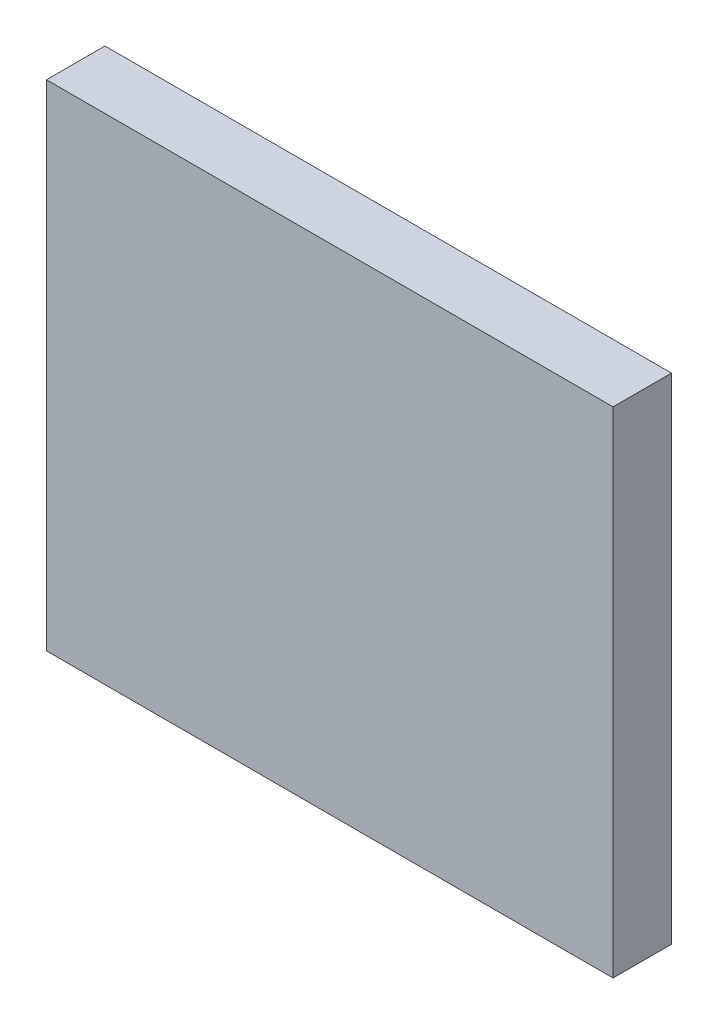
ISO-10303-21;
HEADER;
FILE_DESCRIPTION(('STEP AP214'),'2;1');
FILE_NAME('part.step','',(''),(''),'','','');
FILE_SCHEMA(('AUTOMOTIVE_DESIGN { 1 0 10303 214 1 1 1 1 }'));
ENDSEC;
DATA;
#1=APPLICATION_CONTEXT('core data for automotive mechanical design processes');
#2=APPLICATION_PROTOCOL_DEFINITION('international standard','automotive_design',2000,#1);
#3=PRODUCT_CONTEXT('',#1,'mechanical');
#4=PRODUCT('Part','Part','',(#3));
#5=PRODUCT_RELATED_PRODUCT_CATEGORY('part','',(#4));
#6=PRODUCT_DEFINITION_FORMATION('','',#4);
#7=PRODUCT_DEFINITION_CONTEXT('part definition',#1,'design');
#8=PRODUCT_DEFINITION('design','',#6,#7);
#9=PRODUCT_DEFINITION_SHAPE('','',#8);
#10=(LENGTH_UNIT() NAMED_UNIT(*) SI_UNIT(.MILLI.,.METRE.));
#11=(NAMED_UNIT(*) PLANE_ANGLE_UNIT() SI_UNIT($,.RADIAN.));
#12=(NAMED_UNIT(*) SI_UNIT($,.STERADIAN.) SOLID_ANGLE_UNIT());
#13=UNCERTAINTY_MEASURE_WITH_UNIT(LENGTH_MEASURE(1.E-05),#10,'distance_accuracy_value','');
#14=(GEOMETRIC_REPRESENTATION_CONTEXT(3) GLOBAL_UNCERTAINTY_ASSIGNED_CONTEXT((#13)) GLOBAL_UNIT_ASSIGNED_CONTEXT((#10,
#11,#12)) REPRESENTATION_CONTEXT('',''));
#15=CARTESIAN_POINT('',(0.,0.,0.));
#16=DIRECTION('',(0.,0.,1.));
#17=DIRECTION('',(1.,0.,0.));
#18=AXIS2_PLACEMENT_3D('',#15,#16,#17);
#19=CARTESIAN_POINT('',(31.5,27.5,6.5));
#20=DIRECTION('',(-1.,0.,0.));
#21=DIRECTION('',(0.,0.,1.));
#22=AXIS2_PLACEMENT_3D('',#19,#20,#21);
#23=PLANE('',#22);
#24=DIRECTION('',(0.,1.,0.));
#25=VECTOR('',#24,1.);
#26=CARTESIAN_POINT('',(31.5,27.5,0.));
#27=LINE('',#26,#25);
#28=CARTESIAN_POINT('',(31.5,-27.5,0.));
#29=VERTEX_POINT('',#28);
#30=CARTESIAN_POINT('',(31.5,27.5,0.));
#31=VERTEX_POINT('',#30);
#32=EDGE_CURVE('E96',#29,#31,#27,.T.);
#33=ORIENTED_EDGE('',*,*,#32,.T.);
#34=DIRECTION('',(0.,0.,-1.));
#35=VECTOR('',#34,1.);
#36=CARTESIAN_POINT('',(31.5,27.5,6.5));
#37=LINE('',#36,#35);
#38=CARTESIAN_POINT('',(31.5,27.5,6.5));
#39=VERTEX_POINT('',#38);
#40=EDGE_CURVE('E11',#39,#31,#37,.T.);
#41=ORIENTED_EDGE('',*,*,#40,.F.);
#42=DIRECTION('',(0.,1.,0.));
#43=VECTOR('',#42,1.);
#44=CARTESIAN_POINT('',(31.5,27.5,6.5));
#45=LINE('',#44,#43);
#46=CARTESIAN_POINT('',(31.5,-27.5,6.5));
#47=VERTEX_POINT('',#46);
#48=EDGE_CURVE('E84',#47,#39,#45,.T.);
#49=ORIENTED_EDGE('',*,*,#48,.F.);
#50=DIRECTION('',(0.,0.,-1.));
#51=VECTOR('',#50,1.);
#52=CARTESIAN_POINT('',(31.5,-27.5,6.5));
#53=LINE('',#52,#51);
#54=EDGE_CURVE('E92',#47,#29,#53,.T.);
#55=ORIENTED_EDGE('',*,*,#54,.T.);
#56=EDGE_LOOP('',(#33,#41,#49,#55));
#57=FACE_BOUND('',#56,.T.);
#58=ADVANCED_FACE('F33',(#57),#23,.F.);
#59=CARTESIAN_POINT('',(-31.5,27.5,6.5));
#60=DIRECTION('',(0.,-1.,0.));
#61=DIRECTION('',(1.,0.,0.));
#62=AXIS2_PLACEMENT_3D('',#59,#60,#61);
#63=PLANE('',#62);
#64=DIRECTION('',(-1.,0.,0.));
#65=VECTOR('',#64,1.);
#66=CARTESIAN_POINT('',(-31.5,27.5,0.));
#67=LINE('',#66,#65);
#68=CARTESIAN_POINT('',(-31.5,27.5,0.));
#69=VERTEX_POINT('',#68);
#70=EDGE_CURVE('E88',#31,#69,#67,.T.);
#71=ORIENTED_EDGE('',*,*,#70,.T.);
#72=DIRECTION('',(0.,0.,-1.));
#73=VECTOR('',#72,1.);
#74=CARTESIAN_POINT('',(-31.5,27.5,6.5));
#75=LINE('',#74,#73);
#76=CARTESIAN_POINT('',(-31.5,27.5,6.5));
#77=VERTEX_POINT('',#76);
#78=EDGE_CURVE('E41',#77,#69,#75,.T.);
#79=ORIENTED_EDGE('',*,*,#78,.F.);
#80=DIRECTION('',(-1.,0.,0.));
#81=VECTOR('',#80,1.);
#82=CARTESIAN_POINT('',(-31.5,27.5,6.5));
#83=LINE('',#82,#81);
#84=EDGE_CURVE('E79',#39,#77,#83,.T.);
#85=ORIENTED_EDGE('',*,*,#84,.F.);
#86=ORIENTED_EDGE('',*,*,#40,.T.);
#87=EDGE_LOOP('',(#71,#79,#85,#86));
#88=FACE_BOUND('',#87,.T.);
#89=ADVANCED_FACE('F87',(#88),#63,.F.);
#90=CARTESIAN_POINT('',(-31.5,27.5,6.5));
#91=DIRECTION('',(1.,0.,0.));
#92=DIRECTION('',(0.,0.,-1.));
#93=AXIS2_PLACEMENT_3D('',#90,#91,#92);
#94=PLANE('',#93);
#95=DIRECTION('',(0.,-1.,0.));
#96=VECTOR('',#95,1.);
#97=CARTESIAN_POINT('',(-31.5,27.5,0.));
#98=LINE('',#97,#96);
#99=CARTESIAN_POINT('',(-31.5,-27.5,0.));
#100=VERTEX_POINT('',#99);
#101=EDGE_CURVE('E66',#69,#100,#98,.T.);
#102=ORIENTED_EDGE('',*,*,#101,.T.);
#103=DIRECTION('',(0.,0.,-1.));
#104=VECTOR('',#103,1.);
#105=CARTESIAN_POINT('',(-31.5,-27.5,6.5));
#106=LINE('',#105,#104);
#107=CARTESIAN_POINT('',(-31.5,-27.5,6.5));
#108=VERTEX_POINT('',#107);
#109=EDGE_CURVE('E89',#108,#100,#106,.T.);
#110=ORIENTED_EDGE('',*,*,#109,.F.);
#111=DIRECTION('',(0.,-1.,0.));
#112=VECTOR('',#111,1.);
#113=CARTESIAN_POINT('',(-31.5,27.5,6.5));
#114=LINE('',#113,#112);
#115=EDGE_CURVE('E82',#77,#108,#114,.T.);
#116=ORIENTED_EDGE('',*,*,#115,.F.);
#117=ORIENTED_EDGE('',*,*,#78,.T.);
#118=EDGE_LOOP('',(#102,#110,#116,#117));
#119=FACE_BOUND('',#118,.T.);
#120=ADVANCED_FACE('F90',(#119),#94,.F.);
#121=CARTESIAN_POINT('',(-31.5,-27.5,6.5));
#122=DIRECTION('',(0.,1.,0.));
#123=DIRECTION('',(0.,0.,1.));
#124=AXIS2_PLACEMENT_3D('',#121,#122,#123);
#125=PLANE('',#124);
#126=DIRECTION('',(1.,0.,0.));
#127=VECTOR('',#126,1.);
#128=CARTESIAN_POINT('',(-31.5,-27.5,0.));
#129=LINE('',#128,#127);
#130=EDGE_CURVE('E72',#100,#29,#129,.T.);
#131=ORIENTED_EDGE('',*,*,#130,.T.);
#132=ORIENTED_EDGE('',*,*,#54,.F.);
#133=DIRECTION('',(1.,0.,0.));
#134=VECTOR('',#133,1.);
#135=CARTESIAN_POINT('',(-31.5,-27.5,6.5));
#136=LINE('',#135,#134);
#137=EDGE_CURVE('E49',#108,#47,#136,.T.);
#138=ORIENTED_EDGE('',*,*,#137,.F.);
#139=ORIENTED_EDGE('',*,*,#109,.T.);
#140=EDGE_LOOP('',(#131,#132,#138,#139));
#141=FACE_BOUND('',#140,.T.);
#142=ADVANCED_FACE('F103',(#141),#125,.F.);
#143=CARTESIAN_POINT('',(0.,0.,6.5));
#144=DIRECTION('',(0.,0.,1.));
#145=DIRECTION('',(1.,0.,0.));
#146=AXIS2_PLACEMENT_3D('',#143,#144,#145);
#147=PLANE('',#146);
#148=ORIENTED_EDGE('',*,*,#48,.T.);
#149=ORIENTED_EDGE('',*,*,#84,.T.);
#150=ORIENTED_EDGE('',*,*,#115,.T.);
#151=ORIENTED_EDGE('',*,*,#137,.T.);
#152=EDGE_LOOP('',(#148,#149,#150,#151));
#153=FACE_BOUND('',#152,.T.);
#154=ADVANCED_FACE('F80',(#153),#147,.T.);
#155=CARTESIAN_POINT('',(0.,0.,0.));
#156=DIRECTION('',(0.,0.,1.));
#157=DIRECTION('',(1.,0.,0.));
#158=AXIS2_PLACEMENT_3D('',#155,#156,#157);
#159=PLANE('',#158);
#160=ORIENTED_EDGE('',*,*,#32,.F.);
#161=ORIENTED_EDGE('',*,*,#130,.F.);
#162=ORIENTED_EDGE('',*,*,#101,.F.);
#163=ORIENTED_EDGE('',*,*,#70,.F.);
#164=EDGE_LOOP('',(#160,#161,#162,#163));
#165=FACE_BOUND('',#164,.T.);
#166=ADVANCED_FACE('F106',(#165),#159,.F.);
#167=CLOSED_SHELL('',(#58,#89,#120,#142,#154,#166));
#168=MANIFOLD_SOLID_BREP('B2',#167);
#169=ADVANCED_BREP_SHAPE_REPRESENTATION('',(#18,#168),#14);
#170=SHAPE_DEFINITION_REPRESENTATION(#9,#169);
ENDSEC;
END-ISO-10303-21;
